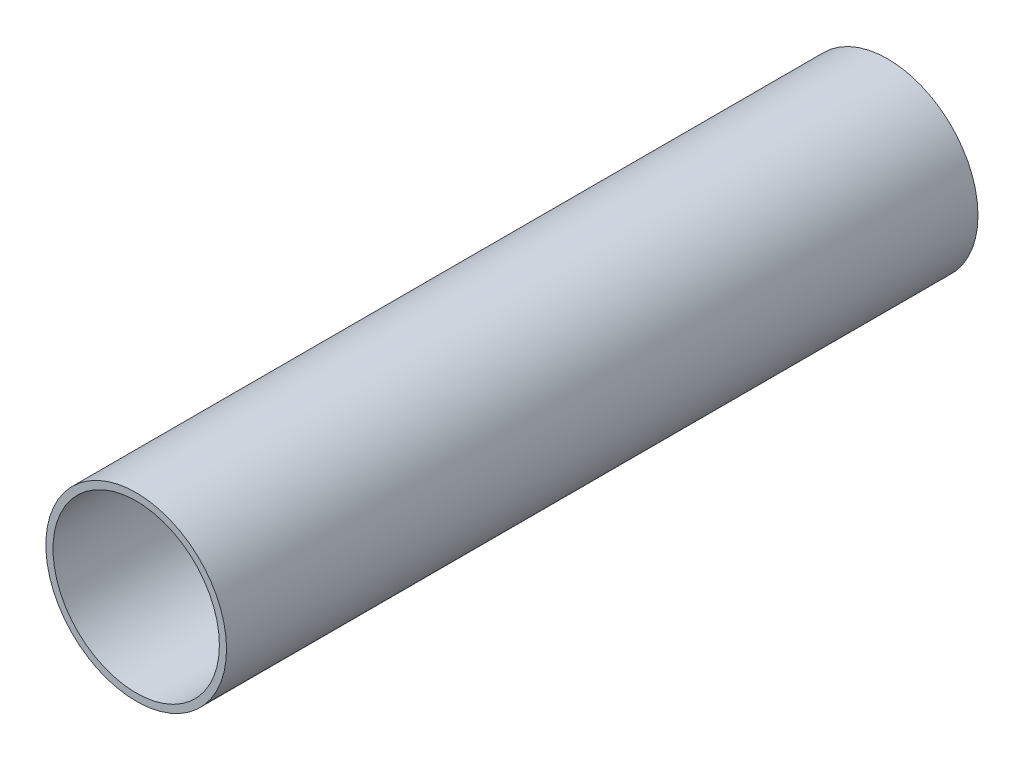
ISO-10303-21;
HEADER;
FILE_DESCRIPTION(('STEP AP214'),'2;1');
FILE_NAME('part.step','',(''),(''),'','','');
FILE_SCHEMA(('AUTOMOTIVE_DESIGN { 1 0 10303 214 1 1 1 1 }'));
ENDSEC;
DATA;
#1=APPLICATION_CONTEXT('core data for automotive mechanical design processes');
#2=APPLICATION_PROTOCOL_DEFINITION('international standard','automotive_design',2000,#1);
#3=PRODUCT_CONTEXT('',#1,'mechanical');
#4=PRODUCT('Part','Part','',(#3));
#5=PRODUCT_RELATED_PRODUCT_CATEGORY('part','',(#4));
#6=PRODUCT_DEFINITION_FORMATION('','',#4);
#7=PRODUCT_DEFINITION_CONTEXT('part definition',#1,'design');
#8=PRODUCT_DEFINITION('design','',#6,#7);
#9=PRODUCT_DEFINITION_SHAPE('','',#8);
#10=(LENGTH_UNIT() NAMED_UNIT(*) SI_UNIT(.MILLI.,.METRE.));
#11=(NAMED_UNIT(*) PLANE_ANGLE_UNIT() SI_UNIT($,.RADIAN.));
#12=(NAMED_UNIT(*) SI_UNIT($,.STERADIAN.) SOLID_ANGLE_UNIT());
#13=UNCERTAINTY_MEASURE_WITH_UNIT(LENGTH_MEASURE(1.E-05),#10,'distance_accuracy_value','');
#14=(GEOMETRIC_REPRESENTATION_CONTEXT(3) GLOBAL_UNCERTAINTY_ASSIGNED_CONTEXT((#13)) GLOBAL_UNIT_ASSIGNED_CONTEXT((#10,
#11,#12)) REPRESENTATION_CONTEXT('',''));
#15=CARTESIAN_POINT('',(0.,0.,0.));
#16=DIRECTION('',(0.,0.,1.));
#17=DIRECTION('',(1.,0.,0.));
#18=AXIS2_PLACEMENT_3D('',#15,#16,#17);
#19=CARTESIAN_POINT('',(0.,0.,210.));
#20=DIRECTION('',(0.,0.,1.));
#21=DIRECTION('',(1.,0.,0.));
#22=AXIS2_PLACEMENT_3D('',#19,#20,#21);
#23=PLANE('',#22);
#24=CARTESIAN_POINT('',(0.,0.,210.));
#25=DIRECTION('',(0.,0.,1.));
#26=DIRECTION('',(1.,0.,0.));
#27=AXIS2_PLACEMENT_3D('',#24,#25,#26);
#28=CIRCLE('',#27,25.25);
#29=CARTESIAN_POINT('',(25.25,0.,210.));
#30=VERTEX_POINT('',#29);
#31=EDGE_CURVE('E108',#30,#30,#28,.T.);
#32=ORIENTED_EDGE('',*,*,#31,.T.);
#33=EDGE_LOOP('',(#32));
#34=FACE_BOUND('',#33,.T.);
#35=CARTESIAN_POINT('',(0.,0.,210.));
#36=DIRECTION('',(0.,0.,1.));
#37=DIRECTION('',(1.,0.,0.));
#38=AXIS2_PLACEMENT_3D('',#35,#36,#37);
#39=CIRCLE('',#38,23.25);
#40=CARTESIAN_POINT('',(23.25,0.,210.));
#41=VERTEX_POINT('',#40);
#42=EDGE_CURVE('E102',#41,#41,#39,.T.);
#43=ORIENTED_EDGE('',*,*,#42,.F.);
#44=EDGE_LOOP('',(#43));
#45=FACE_BOUND('',#44,.T.);
#46=ADVANCED_FACE('F33',(#34,#45),#23,.T.);
#47=CARTESIAN_POINT('',(0.,0.,0.));
#48=DIRECTION('',(0.,0.,1.));
#49=DIRECTION('',(1.,0.,0.));
#50=AXIS2_PLACEMENT_3D('',#47,#48,#49);
#51=PLANE('',#50);
#52=CARTESIAN_POINT('',(0.,0.,0.));
#53=DIRECTION('',(0.,0.,1.));
#54=DIRECTION('',(1.,0.,0.));
#55=AXIS2_PLACEMENT_3D('',#52,#53,#54);
#56=CIRCLE('',#55,25.25);
#57=CARTESIAN_POINT('',(25.25,0.,0.));
#58=VERTEX_POINT('',#57);
#59=EDGE_CURVE('E105',#58,#58,#56,.T.);
#60=ORIENTED_EDGE('',*,*,#59,.F.);
#61=EDGE_LOOP('',(#60));
#62=FACE_BOUND('',#61,.T.);
#63=CARTESIAN_POINT('',(0.,0.,0.));
#64=DIRECTION('',(0.,0.,1.));
#65=DIRECTION('',(1.,0.,0.));
#66=AXIS2_PLACEMENT_3D('',#63,#64,#65);
#67=CIRCLE('',#66,23.25);
#68=CARTESIAN_POINT('',(23.25,0.,0.));
#69=VERTEX_POINT('',#68);
#70=EDGE_CURVE('E94',#69,#69,#67,.T.);
#71=ORIENTED_EDGE('',*,*,#70,.T.);
#72=EDGE_LOOP('',(#71));
#73=FACE_BOUND('',#72,.T.);
#74=ADVANCED_FACE('F130',(#62,#73),#51,.F.);
#75=CARTESIAN_POINT('',(0.,0.,210.));
#76=DIRECTION('',(0.,0.,-1.));
#77=DIRECTION('',(-1.,0.,0.));
#78=AXIS2_PLACEMENT_3D('',#75,#76,#77);
#79=CYLINDRICAL_SURFACE('',#78,25.25);
#80=CARTESIAN_POINT('',(0.,0.,36.));
#81=DIRECTION('',(0.,0.,-1.));
#82=DIRECTION('',(-1.,0.,0.));
#83=AXIS2_PLACEMENT_3D('',#80,#81,#82);
#84=CIRCLE('',#83,25.25);
#85=CARTESIAN_POINT('',(-14.,-21.0133885891828,36.));
#86=VERTEX_POINT('',#85);
#87=CARTESIAN_POINT('',(14.,-21.0133885891828,36.));
#88=VERTEX_POINT('',#87);
#89=EDGE_CURVE('E79',#86,#88,#84,.F.);
#90=ORIENTED_EDGE('',*,*,#89,.F.);
#91=DIRECTION('',(0.,0.,-1.));
#92=VECTOR('',#91,1.);
#93=CARTESIAN_POINT('',(-14.,-21.0133885891828,210.));
#94=LINE('',#93,#92);
#95=CARTESIAN_POINT('',(-14.,-21.0133885891828,158.));
#96=VERTEX_POINT('',#95);
#97=EDGE_CURVE('E86',#96,#86,#94,.T.);
#98=ORIENTED_EDGE('',*,*,#97,.F.);
#99=CARTESIAN_POINT('',(0.,0.,158.));
#100=DIRECTION('',(0.,0.,1.));
#101=DIRECTION('',(1.,0.,0.));
#102=AXIS2_PLACEMENT_3D('',#99,#100,#101);
#103=CIRCLE('',#102,25.25);
#104=CARTESIAN_POINT('',(14.,-21.0133885891828,158.));
#105=VERTEX_POINT('',#104);
#106=EDGE_CURVE('E90',#105,#96,#103,.F.);
#107=ORIENTED_EDGE('',*,*,#106,.F.);
#108=DIRECTION('',(0.,0.,-1.));
#109=VECTOR('',#108,1.);
#110=CARTESIAN_POINT('',(14.,-21.0133885891828,210.));
#111=LINE('',#110,#109);
#112=EDGE_CURVE('E48',#88,#105,#111,.F.);
#113=ORIENTED_EDGE('',*,*,#112,.F.);
#114=EDGE_LOOP('',(#90,#98,#107,#113));
#115=FACE_BOUND('',#114,.T.);
#116=ORIENTED_EDGE('',*,*,#31,.F.);
#117=EDGE_LOOP('',(#116));
#118=FACE_BOUND('',#117,.T.);
#119=ORIENTED_EDGE('',*,*,#59,.T.);
#120=EDGE_LOOP('',(#119));
#121=FACE_BOUND('',#120,.T.);
#122=ADVANCED_FACE('F35',(#115,#118,#121),#79,.T.);
#123=CARTESIAN_POINT('',(0.,0.,210.));
#124=DIRECTION('',(0.,0.,-1.));
#125=DIRECTION('',(-1.,0.,0.));
#126=AXIS2_PLACEMENT_3D('',#123,#124,#125);
#127=CYLINDRICAL_SURFACE('',#126,23.25);
#128=DIRECTION('',(0.,0.,-1.));
#129=VECTOR('',#128,1.);
#130=CARTESIAN_POINT('',(-14.,-18.5623947808465,210.));
#131=LINE('',#130,#129);
#132=CARTESIAN_POINT('',(-14.,-18.5623947808466,36.));
#133=VERTEX_POINT('',#132);
#134=CARTESIAN_POINT('',(-14.,-18.5623947808466,158.));
#135=VERTEX_POINT('',#134);
#136=EDGE_CURVE('E11',#133,#135,#131,.F.);
#137=ORIENTED_EDGE('',*,*,#136,.F.);
#138=CARTESIAN_POINT('',(0.,0.,36.));
#139=DIRECTION('',(0.,0.,-1.));
#140=DIRECTION('',(-1.,0.,0.));
#141=AXIS2_PLACEMENT_3D('',#138,#139,#140);
#142=CIRCLE('',#141,23.25);
#143=CARTESIAN_POINT('',(14.,-18.5623947808465,36.));
#144=VERTEX_POINT('',#143);
#145=EDGE_CURVE('E41',#144,#133,#142,.T.);
#146=ORIENTED_EDGE('',*,*,#145,.F.);
#147=DIRECTION('',(0.,0.,-1.));
#148=VECTOR('',#147,1.);
#149=CARTESIAN_POINT('',(14.,-18.5623947808465,210.));
#150=LINE('',#149,#148);
#151=CARTESIAN_POINT('',(14.,-18.5623947808466,158.));
#152=VERTEX_POINT('',#151);
#153=EDGE_CURVE('E115',#152,#144,#150,.T.);
#154=ORIENTED_EDGE('',*,*,#153,.F.);
#155=CARTESIAN_POINT('',(0.,0.,158.));
#156=DIRECTION('',(0.,0.,1.));
#157=DIRECTION('',(1.,0.,0.));
#158=AXIS2_PLACEMENT_3D('',#155,#156,#157);
#159=CIRCLE('',#158,23.25);
#160=EDGE_CURVE('E111',#135,#152,#159,.T.);
#161=ORIENTED_EDGE('',*,*,#160,.F.);
#162=EDGE_LOOP('',(#137,#146,#154,#161));
#163=FACE_BOUND('',#162,.T.);
#164=ORIENTED_EDGE('',*,*,#42,.T.);
#165=EDGE_LOOP('',(#164));
#166=FACE_BOUND('',#165,.T.);
#167=ORIENTED_EDGE('',*,*,#70,.F.);
#168=EDGE_LOOP('',(#167));
#169=FACE_BOUND('',#168,.T.);
#170=ADVANCED_FACE('F120',(#163,#166,#169),#127,.F.);
#171=CARTESIAN_POINT('',(-14.,-25.251,36.));
#172=DIRECTION('',(-1.,0.,0.));
#173=DIRECTION('',(0.,0.,1.));
#174=AXIS2_PLACEMENT_3D('',#171,#172,#173);
#175=PLANE('',#174);
#176=ORIENTED_EDGE('',*,*,#136,.T.);
#177=DIRECTION('',(0.,1.,0.));
#178=VECTOR('',#177,1.);
#179=CARTESIAN_POINT('',(-14.,-25.251,158.));
#180=LINE('',#179,#178);
#181=EDGE_CURVE('E56',#96,#135,#180,.T.);
#182=ORIENTED_EDGE('',*,*,#181,.F.);
#183=ORIENTED_EDGE('',*,*,#97,.T.);
#184=DIRECTION('',(0.,1.,0.));
#185=VECTOR('',#184,1.);
#186=CARTESIAN_POINT('',(-14.,-25.251,36.));
#187=LINE('',#186,#185);
#188=EDGE_CURVE('E74',#86,#133,#187,.T.);
#189=ORIENTED_EDGE('',*,*,#188,.T.);
#190=EDGE_LOOP('',(#176,#182,#183,#189));
#191=FACE_BOUND('',#190,.T.);
#192=ADVANCED_FACE('F87',(#191),#175,.F.);
#193=CARTESIAN_POINT('',(-14.,-25.251,36.));
#194=DIRECTION('',(0.,0.,-1.));
#195=DIRECTION('',(-1.,0.,0.));
#196=AXIS2_PLACEMENT_3D('',#193,#194,#195);
#197=PLANE('',#196);
#198=ORIENTED_EDGE('',*,*,#145,.T.);
#199=ORIENTED_EDGE('',*,*,#188,.F.);
#200=ORIENTED_EDGE('',*,*,#89,.T.);
#201=DIRECTION('',(0.,1.,0.));
#202=VECTOR('',#201,1.);
#203=CARTESIAN_POINT('',(14.,-25.251,36.));
#204=LINE('',#203,#202);
#205=EDGE_CURVE('E83',#88,#144,#204,.T.);
#206=ORIENTED_EDGE('',*,*,#205,.T.);
#207=EDGE_LOOP('',(#198,#199,#200,#206));
#208=FACE_BOUND('',#207,.T.);
#209=ADVANCED_FACE('F76',(#208),#197,.F.);
#210=CARTESIAN_POINT('',(14.,-25.251,36.));
#211=DIRECTION('',(1.,0.,0.));
#212=DIRECTION('',(0.,0.,-1.));
#213=AXIS2_PLACEMENT_3D('',#210,#211,#212);
#214=PLANE('',#213);
#215=ORIENTED_EDGE('',*,*,#153,.T.);
#216=ORIENTED_EDGE('',*,*,#205,.F.);
#217=ORIENTED_EDGE('',*,*,#112,.T.);
#218=DIRECTION('',(0.,1.,0.));
#219=VECTOR('',#218,1.);
#220=CARTESIAN_POINT('',(14.,-25.251,158.));
#221=LINE('',#220,#219);
#222=EDGE_CURVE('E97',#105,#152,#221,.T.);
#223=ORIENTED_EDGE('',*,*,#222,.T.);
#224=EDGE_LOOP('',(#215,#216,#217,#223));
#225=FACE_BOUND('',#224,.T.);
#226=ADVANCED_FACE('F117',(#225),#214,.F.);
#227=CARTESIAN_POINT('',(-14.,-25.251,158.));
#228=DIRECTION('',(0.,0.,1.));
#229=DIRECTION('',(1.,0.,0.));
#230=AXIS2_PLACEMENT_3D('',#227,#228,#229);
#231=PLANE('',#230);
#232=ORIENTED_EDGE('',*,*,#160,.T.);
#233=ORIENTED_EDGE('',*,*,#222,.F.);
#234=ORIENTED_EDGE('',*,*,#106,.T.);
#235=ORIENTED_EDGE('',*,*,#181,.T.);
#236=EDGE_LOOP('',(#232,#233,#234,#235));
#237=FACE_BOUND('',#236,.T.);
#238=ADVANCED_FACE('F122',(#237),#231,.F.);
#239=CLOSED_SHELL('',(#46,#74,#122,#170,#192,#209,#226,#238));
#240=MANIFOLD_SOLID_BREP('B2',#239);
#241=ADVANCED_BREP_SHAPE_REPRESENTATION('',(#18,#240),#14);
#242=SHAPE_DEFINITION_REPRESENTATION(#9,#241);
ENDSEC;
END-ISO-10303-21;
